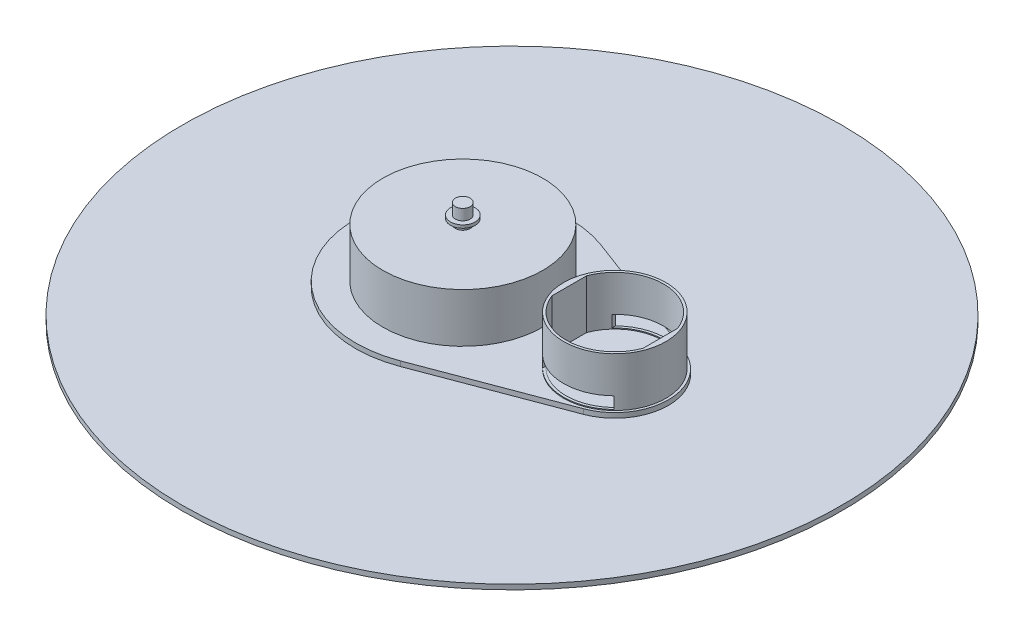
ISO-10303-21;
HEADER;
FILE_DESCRIPTION(('STEP AP214'),'2;1');
FILE_NAME('part.step','',(''),(''),'','','');
FILE_SCHEMA(('AUTOMOTIVE_DESIGN { 1 0 10303 214 1 1 1 1 }'));
ENDSEC;
DATA;
#1=APPLICATION_CONTEXT('core data for automotive mechanical design processes');
#2=APPLICATION_PROTOCOL_DEFINITION('international standard','automotive_design',2000,#1);
#3=PRODUCT_CONTEXT('',#1,'mechanical');
#4=PRODUCT('Part','Part','',(#3));
#5=PRODUCT_RELATED_PRODUCT_CATEGORY('part','',(#4));
#6=PRODUCT_DEFINITION_FORMATION('','',#4);
#7=PRODUCT_DEFINITION_CONTEXT('part definition',#1,'design');
#8=PRODUCT_DEFINITION('design','',#6,#7);
#9=PRODUCT_DEFINITION_SHAPE('','',#8);
#10=(LENGTH_UNIT() NAMED_UNIT(*) SI_UNIT(.MILLI.,.METRE.));
#11=(NAMED_UNIT(*) PLANE_ANGLE_UNIT() SI_UNIT($,.RADIAN.));
#12=(NAMED_UNIT(*) SI_UNIT($,.STERADIAN.) SOLID_ANGLE_UNIT());
#13=UNCERTAINTY_MEASURE_WITH_UNIT(LENGTH_MEASURE(1.E-05),#10,'distance_accuracy_value','');
#14=(GEOMETRIC_REPRESENTATION_CONTEXT(3) GLOBAL_UNCERTAINTY_ASSIGNED_CONTEXT((#13)) GLOBAL_UNIT_ASSIGNED_CONTEXT((#10,
#11,#12)) REPRESENTATION_CONTEXT('',''));
#15=CARTESIAN_POINT('',(0.,0.,0.));
#16=DIRECTION('',(0.,0.,1.));
#17=DIRECTION('',(1.,0.,0.));
#18=AXIS2_PLACEMENT_3D('',#15,#16,#17);
#19=CARTESIAN_POINT('',(109.,60.3,0.));
#20=DIRECTION('',(0.,-1.,0.));
#21=DIRECTION('',(0.,0.,-1.));
#22=AXIS2_PLACEMENT_3D('',#19,#20,#21);
#23=CYLINDRICAL_SURFACE('',#22,7.5);
#24=CARTESIAN_POINT('',(109.,55.,0.));
#25=DIRECTION('',(0.,1.,0.));
#26=DIRECTION('',(0.,0.,1.));
#27=AXIS2_PLACEMENT_3D('',#24,#25,#26);
#28=CIRCLE('',#27,7.5);
#29=CARTESIAN_POINT('',(109.,55.,7.5));
#30=VERTEX_POINT('',#29);
#31=EDGE_CURVE('E198',#30,#30,#28,.T.);
#32=ORIENTED_EDGE('',*,*,#31,.T.);
#33=EDGE_LOOP('',(#32));
#34=FACE_BOUND('',#33,.T.);
#35=CARTESIAN_POINT('',(109.,60.3,0.));
#36=DIRECTION('',(0.,1.,0.));
#37=DIRECTION('',(0.,0.,1.));
#38=AXIS2_PLACEMENT_3D('',#35,#36,#37);
#39=CIRCLE('',#38,7.5);
#40=CARTESIAN_POINT('',(109.,60.3,7.5));
#41=VERTEX_POINT('',#40);
#42=EDGE_CURVE('E213',#41,#41,#39,.T.);
#43=ORIENTED_EDGE('',*,*,#42,.F.);
#44=EDGE_LOOP('',(#43));
#45=FACE_BOUND('',#44,.T.);
#46=ADVANCED_FACE('F40',(#34,#45),#23,.T.);
#47=CARTESIAN_POINT('',(109.,63.3,0.));
#48=DIRECTION('',(0.,-1.,0.));
#49=DIRECTION('',(0.,0.,-1.));
#50=AXIS2_PLACEMENT_3D('',#47,#48,#49);
#51=CYLINDRICAL_SURFACE('',#50,12.5);
#52=CARTESIAN_POINT('',(109.,63.3,0.));
#53=DIRECTION('',(0.,1.,0.));
#54=DIRECTION('',(0.,0.,1.));
#55=AXIS2_PLACEMENT_3D('',#52,#53,#54);
#56=CIRCLE('',#55,12.5);
#57=CARTESIAN_POINT('',(109.,63.3,12.5));
#58=VERTEX_POINT('',#57);
#59=EDGE_CURVE('E210',#58,#58,#56,.T.);
#60=ORIENTED_EDGE('',*,*,#59,.F.);
#61=EDGE_LOOP('',(#60));
#62=FACE_BOUND('',#61,.T.);
#63=CARTESIAN_POINT('',(109.,60.3,0.));
#64=DIRECTION('',(0.,1.,0.));
#65=DIRECTION('',(0.,0.,1.));
#66=AXIS2_PLACEMENT_3D('',#63,#64,#65);
#67=CIRCLE('',#66,12.5);
#68=CARTESIAN_POINT('',(109.,60.3,12.5));
#69=VERTEX_POINT('',#68);
#70=EDGE_CURVE('E204',#69,#69,#67,.T.);
#71=ORIENTED_EDGE('',*,*,#70,.T.);
#72=EDGE_LOOP('',(#71));
#73=FACE_BOUND('',#72,.T.);
#74=ADVANCED_FACE('F338',(#62,#73),#51,.T.);
#75=CARTESIAN_POINT('',(0.,63.3,0.));
#76=DIRECTION('',(0.,1.,0.));
#77=DIRECTION('',(0.,0.,1.));
#78=AXIS2_PLACEMENT_3D('',#75,#76,#77);
#79=PLANE('',#78);
#80=CARTESIAN_POINT('',(109.,63.3,0.));
#81=DIRECTION('',(0.,1.,0.));
#82=DIRECTION('',(0.,0.,1.));
#83=AXIS2_PLACEMENT_3D('',#80,#81,#82);
#84=CIRCLE('',#83,7.5);
#85=CARTESIAN_POINT('',(109.,63.3,7.5));
#86=VERTEX_POINT('',#85);
#87=EDGE_CURVE('E205',#86,#86,#84,.T.);
#88=ORIENTED_EDGE('',*,*,#87,.F.);
#89=EDGE_LOOP('',(#88));
#90=FACE_BOUND('',#89,.T.);
#91=ORIENTED_EDGE('',*,*,#59,.T.);
#92=EDGE_LOOP('',(#91));
#93=FACE_BOUND('',#92,.T.);
#94=ADVANCED_FACE('F346',(#90,#93),#79,.T.);
#95=CARTESIAN_POINT('',(0.,60.3,0.));
#96=DIRECTION('',(0.,1.,0.));
#97=DIRECTION('',(0.,0.,1.));
#98=AXIS2_PLACEMENT_3D('',#95,#96,#97);
#99=PLANE('',#98);
#100=ORIENTED_EDGE('',*,*,#42,.T.);
#101=EDGE_LOOP('',(#100));
#102=FACE_BOUND('',#101,.T.);
#103=ORIENTED_EDGE('',*,*,#70,.F.);
#104=EDGE_LOOP('',(#103));
#105=FACE_BOUND('',#104,.T.);
#106=ADVANCED_FACE('F432',(#102,#105),#99,.F.);
#107=CARTESIAN_POINT('',(109.,74.3,0.));
#108=DIRECTION('',(0.,-1.,0.));
#109=DIRECTION('',(0.,0.,-1.));
#110=AXIS2_PLACEMENT_3D('',#107,#108,#109);
#111=CYLINDRICAL_SURFACE('',#110,7.5);
#112=CARTESIAN_POINT('',(109.,74.3,0.));
#113=DIRECTION('',(0.,1.,0.));
#114=DIRECTION('',(0.,0.,1.));
#115=AXIS2_PLACEMENT_3D('',#112,#113,#114);
#116=CIRCLE('',#115,7.5);
#117=CARTESIAN_POINT('',(109.,74.3,7.5));
#118=VERTEX_POINT('',#117);
#119=EDGE_CURVE('E201',#118,#118,#116,.T.);
#120=ORIENTED_EDGE('',*,*,#119,.F.);
#121=EDGE_LOOP('',(#120));
#122=FACE_BOUND('',#121,.T.);
#123=ORIENTED_EDGE('',*,*,#87,.T.);
#124=EDGE_LOOP('',(#123));
#125=FACE_BOUND('',#124,.T.);
#126=ADVANCED_FACE('F428',(#122,#125),#111,.T.);
#127=CARTESIAN_POINT('',(109.,74.3,0.));
#128=DIRECTION('',(0.,1.,0.));
#129=DIRECTION('',(0.,0.,1.));
#130=AXIS2_PLACEMENT_3D('',#127,#128,#129);
#131=PLANE('',#130);
#132=ORIENTED_EDGE('',*,*,#119,.T.);
#133=EDGE_LOOP('',(#132));
#134=FACE_BOUND('',#133,.T.);
#135=ADVANCED_FACE('F424',(#134),#131,.T.);
#136=CARTESIAN_POINT('',(109.,55.,0.));
#137=DIRECTION('',(0.,-1.,0.));
#138=DIRECTION('',(0.,0.,-1.));
#139=AXIS2_PLACEMENT_3D('',#136,#137,#138);
#140=CYLINDRICAL_SURFACE('',#139,81.2755826030411);
#141=CARTESIAN_POINT('',(109.,55.,0.));
#142=DIRECTION('',(0.,1.,0.));
#143=DIRECTION('',(0.,0.,1.));
#144=AXIS2_PLACEMENT_3D('',#141,#142,#143);
#145=CIRCLE('',#144,81.2755826030411);
#146=CARTESIAN_POINT('',(109.,55.,81.2755826030411));
#147=VERTEX_POINT('',#146);
#148=EDGE_CURVE('E195',#147,#147,#145,.T.);
#149=ORIENTED_EDGE('',*,*,#148,.F.);
#150=EDGE_LOOP('',(#149));
#151=FACE_BOUND('',#150,.T.);
#152=CARTESIAN_POINT('',(109.,5.,0.));
#153=DIRECTION('',(0.,1.,0.));
#154=DIRECTION('',(0.,0.,1.));
#155=AXIS2_PLACEMENT_3D('',#152,#153,#154);
#156=CIRCLE('',#155,81.2755826030411);
#157=CARTESIAN_POINT('',(109.,5.,81.2755826030411));
#158=VERTEX_POINT('',#157);
#159=EDGE_CURVE('E192',#158,#158,#156,.T.);
#160=ORIENTED_EDGE('',*,*,#159,.T.);
#161=EDGE_LOOP('',(#160));
#162=FACE_BOUND('',#161,.T.);
#163=ADVANCED_FACE('F420',(#151,#162),#140,.T.);
#164=CARTESIAN_POINT('',(109.,55.,0.));
#165=DIRECTION('',(0.,1.,0.));
#166=DIRECTION('',(0.,0.,1.));
#167=AXIS2_PLACEMENT_3D('',#164,#165,#166);
#168=PLANE('',#167);
#169=ORIENTED_EDGE('',*,*,#31,.F.);
#170=EDGE_LOOP('',(#169));
#171=FACE_BOUND('',#170,.T.);
#172=ORIENTED_EDGE('',*,*,#148,.T.);
#173=EDGE_LOOP('',(#172));
#174=FACE_BOUND('',#173,.T.);
#175=ADVANCED_FACE('F376',(#171,#174),#168,.T.);
#176=CARTESIAN_POINT('',(0.,5.,0.));
#177=DIRECTION('',(0.,1.,0.));
#178=DIRECTION('',(0.,0.,1.));
#179=AXIS2_PLACEMENT_3D('',#176,#177,#178);
#180=PLANE('',#179);
#181=CARTESIAN_POINT('',(263.5,5.,0.));
#182=DIRECTION('',(0.,1.,0.));
#183=DIRECTION('',(0.,0.,1.));
#184=AXIS2_PLACEMENT_3D('',#181,#182,#183);
#185=CIRCLE('',#184,49.5);
#186=CARTESIAN_POINT('',(309.75,5.,-17.6405073623181));
#187=VERTEX_POINT('',#186);
#188=CARTESIAN_POINT('',(217.25,5.,-17.6405073623181));
#189=VERTEX_POINT('',#188);
#190=EDGE_CURVE('E218',#187,#189,#185,.T.);
#191=ORIENTED_EDGE('',*,*,#190,.T.);
#192=DIRECTION('',(0.,0.,1.));
#193=VECTOR('',#192,1.);
#194=CARTESIAN_POINT('',(217.25,5.,-17.6405073623181));
#195=LINE('',#194,#193);
#196=CARTESIAN_POINT('',(217.25,5.,17.6405073623181));
#197=VERTEX_POINT('',#196);
#198=EDGE_CURVE('E231',#189,#197,#195,.T.);
#199=ORIENTED_EDGE('',*,*,#198,.T.);
#200=CARTESIAN_POINT('',(263.5,5.,0.));
#201=DIRECTION('',(0.,1.,0.));
#202=DIRECTION('',(0.,0.,1.));
#203=AXIS2_PLACEMENT_3D('',#200,#201,#202);
#204=CIRCLE('',#203,49.5);
#205=CARTESIAN_POINT('',(309.75,5.,17.6405073623181));
#206=VERTEX_POINT('',#205);
#207=EDGE_CURVE('E233',#197,#206,#204,.T.);
#208=ORIENTED_EDGE('',*,*,#207,.T.);
#209=DIRECTION('',(0.,0.,-1.));
#210=VECTOR('',#209,1.);
#211=CARTESIAN_POINT('',(309.75,5.,-17.6405073623181));
#212=LINE('',#211,#210);
#213=EDGE_CURVE('E222',#206,#187,#212,.T.);
#214=ORIENTED_EDGE('',*,*,#213,.T.);
#215=EDGE_LOOP('',(#191,#199,#208,#214));
#216=FACE_BOUND('',#215,.T.);
#217=ADVANCED_FACE('F359',(#216),#180,.T.);
#218=CARTESIAN_POINT('',(263.5,55.,0.));
#219=DIRECTION('',(0.,-1.,0.));
#220=DIRECTION('',(0.,0.,-1.));
#221=AXIS2_PLACEMENT_3D('',#218,#219,#220);
#222=CYLINDRICAL_SURFACE('',#221,49.5);
#223=DIRECTION('',(0.,-1.,0.));
#224=VECTOR('',#223,1.);
#225=CARTESIAN_POINT('',(227.090087399466,55.,33.5345831108941));
#226=LINE('',#225,#224);
#227=CARTESIAN_POINT('',(227.090087399466,6.,33.5345831108941));
#228=VERTEX_POINT('',#227);
#229=CARTESIAN_POINT('',(227.090087399466,18.,33.5345831108941));
#230=VERTEX_POINT('',#229);
#231=EDGE_CURVE('E186',#228,#230,#226,.F.);
#232=ORIENTED_EDGE('',*,*,#231,.F.);
#233=CARTESIAN_POINT('',(263.5,6.00000000000001,0.));
#234=DIRECTION('',(0.,-1.,0.));
#235=DIRECTION('',(1.,0.,0.));
#236=AXIS2_PLACEMENT_3D('',#233,#234,#235);
#237=CIRCLE('',#236,49.5);
#238=CARTESIAN_POINT('',(299.909912600534,6.00000000000001,33.5345831108941));
#239=VERTEX_POINT('',#238);
#240=EDGE_CURVE('E159',#239,#228,#237,.T.);
#241=ORIENTED_EDGE('',*,*,#240,.F.);
#242=DIRECTION('',(0.,-1.,0.));
#243=VECTOR('',#242,1.);
#244=CARTESIAN_POINT('',(299.909912600534,55.,33.5345831108941));
#245=LINE('',#244,#243);
#246=CARTESIAN_POINT('',(299.909912600534,18.,33.5345831108941));
#247=VERTEX_POINT('',#246);
#248=EDGE_CURVE('E176',#247,#239,#245,.T.);
#249=ORIENTED_EDGE('',*,*,#248,.F.);
#250=CARTESIAN_POINT('',(263.5,18.,0.));
#251=DIRECTION('',(0.,1.,0.));
#252=DIRECTION('',(-1.,0.,0.));
#253=AXIS2_PLACEMENT_3D('',#250,#251,#252);
#254=CIRCLE('',#253,49.5);
#255=EDGE_CURVE('E182',#230,#247,#254,.T.);
#256=ORIENTED_EDGE('',*,*,#255,.F.);
#257=EDGE_LOOP('',(#232,#241,#249,#256));
#258=FACE_BOUND('',#257,.T.);
#259=ORIENTED_EDGE('',*,*,#207,.F.);
#260=DIRECTION('',(0.,-1.,0.));
#261=VECTOR('',#260,1.);
#262=CARTESIAN_POINT('',(217.25,55.,17.6405073623181));
#263=LINE('',#262,#261);
#264=CARTESIAN_POINT('',(217.25,55.,17.6405073623181));
#265=VERTEX_POINT('',#264);
#266=EDGE_CURVE('E241',#265,#197,#263,.T.);
#267=ORIENTED_EDGE('',*,*,#266,.F.);
#268=CARTESIAN_POINT('',(263.5,55.,0.));
#269=DIRECTION('',(0.,1.,0.));
#270=DIRECTION('',(0.,0.,1.));
#271=AXIS2_PLACEMENT_3D('',#268,#269,#270);
#272=CIRCLE('',#271,49.5);
#273=CARTESIAN_POINT('',(309.75,55.,17.6405073623181));
#274=VERTEX_POINT('',#273);
#275=EDGE_CURVE('E224',#265,#274,#272,.T.);
#276=ORIENTED_EDGE('',*,*,#275,.T.);
#277=DIRECTION('',(0.,-1.,0.));
#278=VECTOR('',#277,1.);
#279=CARTESIAN_POINT('',(309.75,55.,17.6405073623181));
#280=LINE('',#279,#278);
#281=EDGE_CURVE('E238',#274,#206,#280,.T.);
#282=ORIENTED_EDGE('',*,*,#281,.T.);
#283=EDGE_LOOP('',(#259,#267,#276,#282));
#284=FACE_BOUND('',#283,.T.);
#285=ADVANCED_FACE('F355',(#258,#284),#222,.F.);
#286=CARTESIAN_POINT('',(309.75,55.,-17.6405073623181));
#287=DIRECTION('',(-1.,0.,0.));
#288=DIRECTION('',(0.,0.,1.));
#289=AXIS2_PLACEMENT_3D('',#286,#287,#288);
#290=PLANE('',#289);
#291=ORIENTED_EDGE('',*,*,#213,.F.);
#292=ORIENTED_EDGE('',*,*,#281,.F.);
#293=DIRECTION('',(0.,0.,-1.));
#294=VECTOR('',#293,1.);
#295=CARTESIAN_POINT('',(309.75,55.,-17.6405073623181));
#296=LINE('',#295,#294);
#297=CARTESIAN_POINT('',(309.75,55.,-17.6405073623181));
#298=VERTEX_POINT('',#297);
#299=EDGE_CURVE('E227',#274,#298,#296,.T.);
#300=ORIENTED_EDGE('',*,*,#299,.T.);
#301=DIRECTION('',(0.,-1.,0.));
#302=VECTOR('',#301,1.);
#303=CARTESIAN_POINT('',(309.75,55.,-17.6405073623181));
#304=LINE('',#303,#302);
#305=EDGE_CURVE('E229',#298,#187,#304,.T.);
#306=ORIENTED_EDGE('',*,*,#305,.T.);
#307=EDGE_LOOP('',(#291,#292,#300,#306));
#308=FACE_BOUND('',#307,.T.);
#309=ADVANCED_FACE('F352',(#308),#290,.T.);
#310=CARTESIAN_POINT('',(263.5,55.,0.));
#311=DIRECTION('',(0.,-1.,0.));
#312=DIRECTION('',(0.,0.,-1.));
#313=AXIS2_PLACEMENT_3D('',#310,#311,#312);
#314=CYLINDRICAL_SURFACE('',#313,49.5);
#315=DIRECTION('',(0.,-1.,0.));
#316=VECTOR('',#315,1.);
#317=CARTESIAN_POINT('',(227.090087399466,55.,-33.5345831108941));
#318=LINE('',#317,#316);
#319=CARTESIAN_POINT('',(227.090087399466,18.,-33.5345831108941));
#320=VERTEX_POINT('',#319);
#321=CARTESIAN_POINT('',(227.090087399466,6.,-33.5345831108941));
#322=VERTEX_POINT('',#321);
#323=EDGE_CURVE('E184',#320,#322,#318,.T.);
#324=ORIENTED_EDGE('',*,*,#323,.F.);
#325=CARTESIAN_POINT('',(263.5,18.,0.));
#326=DIRECTION('',(0.,1.,0.));
#327=DIRECTION('',(-1.,0.,0.));
#328=AXIS2_PLACEMENT_3D('',#325,#326,#327);
#329=CIRCLE('',#328,49.5);
#330=CARTESIAN_POINT('',(299.909912600534,18.,-33.5345831108941));
#331=VERTEX_POINT('',#330);
#332=EDGE_CURVE('E175',#331,#320,#329,.T.);
#333=ORIENTED_EDGE('',*,*,#332,.F.);
#334=DIRECTION('',(0.,-1.,0.));
#335=VECTOR('',#334,1.);
#336=CARTESIAN_POINT('',(299.909912600534,55.,-33.5345831108941));
#337=LINE('',#336,#335);
#338=CARTESIAN_POINT('',(299.909912600534,6.00000000000001,-33.5345831108941));
#339=VERTEX_POINT('',#338);
#340=EDGE_CURVE('E165',#339,#331,#337,.F.);
#341=ORIENTED_EDGE('',*,*,#340,.F.);
#342=CARTESIAN_POINT('',(263.5,6.00000000000001,0.));
#343=DIRECTION('',(0.,-1.,0.));
#344=DIRECTION('',(1.,0.,0.));
#345=AXIS2_PLACEMENT_3D('',#342,#343,#344);
#346=CIRCLE('',#345,49.5);
#347=EDGE_CURVE('E151',#322,#339,#346,.T.);
#348=ORIENTED_EDGE('',*,*,#347,.F.);
#349=EDGE_LOOP('',(#324,#333,#341,#348));
#350=FACE_BOUND('',#349,.T.);
#351=ORIENTED_EDGE('',*,*,#190,.F.);
#352=ORIENTED_EDGE('',*,*,#305,.F.);
#353=CARTESIAN_POINT('',(263.5,55.,0.));
#354=DIRECTION('',(0.,1.,0.));
#355=DIRECTION('',(0.,0.,1.));
#356=AXIS2_PLACEMENT_3D('',#353,#354,#355);
#357=CIRCLE('',#356,49.5);
#358=CARTESIAN_POINT('',(217.25,55.,-17.6405073623181));
#359=VERTEX_POINT('',#358);
#360=EDGE_CURVE('E219',#298,#359,#357,.T.);
#361=ORIENTED_EDGE('',*,*,#360,.T.);
#362=DIRECTION('',(0.,-1.,0.));
#363=VECTOR('',#362,1.);
#364=CARTESIAN_POINT('',(217.25,55.,-17.6405073623181));
#365=LINE('',#364,#363);
#366=EDGE_CURVE('E244',#359,#189,#365,.T.);
#367=ORIENTED_EDGE('',*,*,#366,.T.);
#368=EDGE_LOOP('',(#351,#352,#361,#367));
#369=FACE_BOUND('',#368,.T.);
#370=ADVANCED_FACE('F173',(#350,#369),#314,.F.);
#371=CARTESIAN_POINT('',(217.25,55.,-17.6405073623181));
#372=DIRECTION('',(1.,0.,0.));
#373=DIRECTION('',(0.,0.,-1.));
#374=AXIS2_PLACEMENT_3D('',#371,#372,#373);
#375=PLANE('',#374);
#376=ORIENTED_EDGE('',*,*,#198,.F.);
#377=ORIENTED_EDGE('',*,*,#366,.F.);
#378=DIRECTION('',(0.,0.,1.));
#379=VECTOR('',#378,1.);
#380=CARTESIAN_POINT('',(217.25,55.,-17.6405073623181));
#381=LINE('',#380,#379);
#382=EDGE_CURVE('E221',#359,#265,#381,.T.);
#383=ORIENTED_EDGE('',*,*,#382,.T.);
#384=ORIENTED_EDGE('',*,*,#266,.T.);
#385=EDGE_LOOP('',(#376,#377,#383,#384));
#386=FACE_BOUND('',#385,.T.);
#387=ADVANCED_FACE('F361',(#386),#375,.T.);
#388=CARTESIAN_POINT('',(263.5,55.,0.));
#389=DIRECTION('',(0.,1.,0.));
#390=DIRECTION('',(0.,0.,1.));
#391=AXIS2_PLACEMENT_3D('',#388,#389,#390);
#392=PLANE('',#391);
#393=CARTESIAN_POINT('',(263.5,55.,0.));
#394=DIRECTION('',(0.,1.,0.));
#395=DIRECTION('',(0.,0.,1.));
#396=AXIS2_PLACEMENT_3D('',#393,#394,#395);
#397=CIRCLE('',#396,52.);
#398=CARTESIAN_POINT('',(263.5,55.,52.));
#399=VERTEX_POINT('',#398);
#400=EDGE_CURVE('E248',#399,#399,#397,.T.);
#401=ORIENTED_EDGE('',*,*,#400,.T.);
#402=EDGE_LOOP('',(#401));
#403=FACE_BOUND('',#402,.T.);
#404=ORIENTED_EDGE('',*,*,#382,.F.);
#405=ORIENTED_EDGE('',*,*,#360,.F.);
#406=ORIENTED_EDGE('',*,*,#299,.F.);
#407=ORIENTED_EDGE('',*,*,#275,.F.);
#408=EDGE_LOOP('',(#404,#405,#406,#407));
#409=FACE_BOUND('',#408,.T.);
#410=ADVANCED_FACE('F364',(#403,#409),#392,.T.);
#411=CARTESIAN_POINT('',(263.5,55.,0.));
#412=DIRECTION('',(0.,-1.,0.));
#413=DIRECTION('',(0.,0.,-1.));
#414=AXIS2_PLACEMENT_3D('',#411,#412,#413);
#415=CYLINDRICAL_SURFACE('',#414,52.);
#416=CARTESIAN_POINT('',(263.5,6.00000000000001,0.));
#417=DIRECTION('',(0.,-1.,0.));
#418=DIRECTION('',(1.,0.,0.));
#419=AXIS2_PLACEMENT_3D('',#416,#417,#418);
#420=CIRCLE('',#419,52.);
#421=CARTESIAN_POINT('',(299.909912600534,6.00000000000001,37.1257089416682));
#422=VERTEX_POINT('',#421);
#423=CARTESIAN_POINT('',(227.090087399466,6.,37.1257089416682));
#424=VERTEX_POINT('',#423);
#425=EDGE_CURVE('E287',#422,#424,#420,.T.);
#426=ORIENTED_EDGE('',*,*,#425,.T.);
#427=DIRECTION('',(0.,-1.,0.));
#428=VECTOR('',#427,1.);
#429=CARTESIAN_POINT('',(227.090087399466,55.,37.1257089416682));
#430=LINE('',#429,#428);
#431=CARTESIAN_POINT('',(227.090087399466,18.,37.1257089416682));
#432=VERTEX_POINT('',#431);
#433=EDGE_CURVE('E11',#424,#432,#430,.F.);
#434=ORIENTED_EDGE('',*,*,#433,.T.);
#435=CARTESIAN_POINT('',(263.5,18.,0.));
#436=DIRECTION('',(0.,1.,0.));
#437=DIRECTION('',(-1.,0.,0.));
#438=AXIS2_PLACEMENT_3D('',#435,#436,#437);
#439=CIRCLE('',#438,52.);
#440=CARTESIAN_POINT('',(299.909912600534,18.,37.1257089416682));
#441=VERTEX_POINT('',#440);
#442=EDGE_CURVE('E48',#432,#441,#439,.T.);
#443=ORIENTED_EDGE('',*,*,#442,.T.);
#444=DIRECTION('',(0.,-1.,0.));
#445=VECTOR('',#444,1.);
#446=CARTESIAN_POINT('',(299.909912600534,55.,37.1257089416682));
#447=LINE('',#446,#445);
#448=EDGE_CURVE('E294',#441,#422,#447,.T.);
#449=ORIENTED_EDGE('',*,*,#448,.T.);
#450=EDGE_LOOP('',(#426,#434,#443,#449));
#451=FACE_BOUND('',#450,.T.);
#452=CARTESIAN_POINT('',(299.909912600534,18.,-37.1257089416682));
#453=VERTEX_POINT('',#452);
#454=CARTESIAN_POINT('',(227.090087399466,18.,-37.1257089416682));
#455=VERTEX_POINT('',#454);
#456=EDGE_CURVE('E289',#453,#455,#439,.T.);
#457=ORIENTED_EDGE('',*,*,#456,.T.);
#458=DIRECTION('',(0.,-1.,0.));
#459=VECTOR('',#458,1.);
#460=CARTESIAN_POINT('',(227.090087399466,55.,-37.1257089416682));
#461=LINE('',#460,#459);
#462=CARTESIAN_POINT('',(227.090087399466,6.,-37.1257089416682));
#463=VERTEX_POINT('',#462);
#464=EDGE_CURVE('E292',#455,#463,#461,.T.);
#465=ORIENTED_EDGE('',*,*,#464,.T.);
#466=CARTESIAN_POINT('',(299.909912600534,6.00000000000001,-37.1257089416682));
#467=VERTEX_POINT('',#466);
#468=EDGE_CURVE('E208',#463,#467,#420,.T.);
#469=ORIENTED_EDGE('',*,*,#468,.T.);
#470=DIRECTION('',(0.,-1.,0.));
#471=VECTOR('',#470,1.);
#472=CARTESIAN_POINT('',(299.909912600534,55.,-37.1257089416682));
#473=LINE('',#472,#471);
#474=EDGE_CURVE('E168',#467,#453,#473,.F.);
#475=ORIENTED_EDGE('',*,*,#474,.T.);
#476=EDGE_LOOP('',(#457,#465,#469,#475));
#477=FACE_BOUND('',#476,.T.);
#478=ORIENTED_EDGE('',*,*,#400,.F.);
#479=EDGE_LOOP('',(#478));
#480=FACE_BOUND('',#479,.T.);
#481=CARTESIAN_POINT('',(263.5,5.,0.));
#482=DIRECTION('',(0.,1.,0.));
#483=DIRECTION('',(0.,0.,1.));
#484=AXIS2_PLACEMENT_3D('',#481,#482,#483);
#485=CIRCLE('',#484,52.);
#486=CARTESIAN_POINT('',(263.5,5.,52.));
#487=VERTEX_POINT('',#486);
#488=EDGE_CURVE('E247',#487,#487,#485,.T.);
#489=ORIENTED_EDGE('',*,*,#488,.T.);
#490=EDGE_LOOP('',(#489));
#491=FACE_BOUND('',#490,.T.);
#492=ADVANCED_FACE('F299',(#451,#477,#480,#491),#415,.T.);
#493=CARTESIAN_POINT('',(263.5,5.,0.));
#494=DIRECTION('',(0.,-1.,0.));
#495=DIRECTION('',(0.,0.,-1.));
#496=AXIS2_PLACEMENT_3D('',#493,#494,#495);
#497=CYLINDRICAL_SURFACE('',#496,54.5);
#498=CARTESIAN_POINT('',(263.5,0.,0.));
#499=DIRECTION('',(0.,1.,0.));
#500=DIRECTION('',(0.,0.,1.));
#501=AXIS2_PLACEMENT_3D('',#498,#499,#500);
#502=CIRCLE('',#501,54.5);
#503=CARTESIAN_POINT('',(282.724919093851,0.,50.996592884573));
#504=VERTEX_POINT('',#503);
#505=CARTESIAN_POINT('',(282.724919093851,0.,-50.9965928845729));
#506=VERTEX_POINT('',#505);
#507=EDGE_CURVE('E258',#504,#506,#502,.T.);
#508=ORIENTED_EDGE('',*,*,#507,.T.);
#509=DIRECTION('',(0.,-1.,0.));
#510=VECTOR('',#509,1.);
#511=CARTESIAN_POINT('',(282.724919093851,5.,-50.9965928845729));
#512=LINE('',#511,#510);
#513=CARTESIAN_POINT('',(282.724919093851,5.,-50.9965928845729));
#514=VERTEX_POINT('',#513);
#515=EDGE_CURVE('E264',#514,#506,#512,.T.);
#516=ORIENTED_EDGE('',*,*,#515,.F.);
#517=CARTESIAN_POINT('',(263.5,5.,0.));
#518=DIRECTION('',(0.,1.,0.));
#519=DIRECTION('',(0.,0.,1.));
#520=AXIS2_PLACEMENT_3D('',#517,#518,#519);
#521=CIRCLE('',#520,54.5);
#522=CARTESIAN_POINT('',(282.724919093851,5.,50.996592884573));
#523=VERTEX_POINT('',#522);
#524=EDGE_CURVE('E262',#523,#514,#521,.T.);
#525=ORIENTED_EDGE('',*,*,#524,.F.);
#526=DIRECTION('',(0.,-1.,0.));
#527=VECTOR('',#526,1.);
#528=CARTESIAN_POINT('',(282.724919093851,5.,50.996592884573));
#529=LINE('',#528,#527);
#530=EDGE_CURVE('E276',#523,#504,#529,.T.);
#531=ORIENTED_EDGE('',*,*,#530,.T.);
#532=EDGE_LOOP('',(#508,#516,#525,#531));
#533=FACE_BOUND('',#532,.T.);
#534=ADVANCED_FACE('F373',(#533),#497,.T.);
#535=CARTESIAN_POINT('',(52.0130497166975,5.,137.971364567971));
#536=DIRECTION('',(-0.352750809061489,0.,-0.935717300634367));
#537=DIRECTION('',(-0.935717300634367,0.,0.352750809061489));
#538=AXIS2_PLACEMENT_3D('',#535,#536,#537);
#539=PLANE('',#538);
#540=DIRECTION('',(0.935717300634366,0.,-0.352750809061489));
#541=VECTOR('',#540,1.);
#542=CARTESIAN_POINT('',(52.0130497166975,0.,137.971364567971));
#543=LINE('',#542,#541);
#544=CARTESIAN_POINT('',(147.449838187702,0.,101.993185769146));
#545=VERTEX_POINT('',#544);
#546=EDGE_CURVE('E269',#545,#504,#543,.T.);
#547=ORIENTED_EDGE('',*,*,#546,.T.);
#548=ORIENTED_EDGE('',*,*,#530,.F.);
#549=DIRECTION('',(0.935717300634366,0.,-0.352750809061489));
#550=VECTOR('',#549,1.);
#551=CARTESIAN_POINT('',(52.0130497166975,5.,137.971364567971));
#552=LINE('',#551,#550);
#553=CARTESIAN_POINT('',(147.449838187702,5.,101.993185769146));
#554=VERTEX_POINT('',#553);
#555=EDGE_CURVE('E260',#554,#523,#552,.T.);
#556=ORIENTED_EDGE('',*,*,#555,.F.);
#557=DIRECTION('',(0.,-1.,0.));
#558=VECTOR('',#557,1.);
#559=CARTESIAN_POINT('',(147.449838187702,5.,101.993185769146));
#560=LINE('',#559,#558);
#561=EDGE_CURVE('E279',#554,#545,#560,.T.);
#562=ORIENTED_EDGE('',*,*,#561,.T.);
#563=EDGE_LOOP('',(#547,#548,#556,#562));
#564=FACE_BOUND('',#563,.T.);
#565=ADVANCED_FACE('F381',(#564),#539,.F.);
#566=CARTESIAN_POINT('',(109.,5.,0.));
#567=DIRECTION('',(0.,-1.,0.));
#568=DIRECTION('',(0.,0.,-1.));
#569=AXIS2_PLACEMENT_3D('',#566,#567,#568);
#570=CYLINDRICAL_SURFACE('',#569,109.);
#571=CARTESIAN_POINT('',(109.,0.,0.));
#572=DIRECTION('',(0.,1.,0.));
#573=DIRECTION('',(0.,0.,1.));
#574=AXIS2_PLACEMENT_3D('',#571,#572,#573);
#575=CIRCLE('',#574,109.);
#576=CARTESIAN_POINT('',(147.449838187702,0.,-101.993185769146));
#577=VERTEX_POINT('',#576);
#578=EDGE_CURVE('E266',#577,#545,#575,.T.);
#579=ORIENTED_EDGE('',*,*,#578,.T.);
#580=ORIENTED_EDGE('',*,*,#561,.F.);
#581=CARTESIAN_POINT('',(109.,5.,0.));
#582=DIRECTION('',(0.,1.,0.));
#583=DIRECTION('',(0.,0.,1.));
#584=AXIS2_PLACEMENT_3D('',#581,#582,#583);
#585=CIRCLE('',#584,109.);
#586=CARTESIAN_POINT('',(147.449838187702,5.,-101.993185769146));
#587=VERTEX_POINT('',#586);
#588=EDGE_CURVE('E257',#587,#554,#585,.T.);
#589=ORIENTED_EDGE('',*,*,#588,.F.);
#590=DIRECTION('',(0.,-1.,0.));
#591=VECTOR('',#590,1.);
#592=CARTESIAN_POINT('',(147.449838187702,5.,-101.993185769146));
#593=LINE('',#592,#591);
#594=EDGE_CURVE('E209',#587,#577,#593,.T.);
#595=ORIENTED_EDGE('',*,*,#594,.T.);
#596=EDGE_LOOP('',(#579,#580,#589,#595));
#597=FACE_BOUND('',#596,.T.);
#598=ADVANCED_FACE('F384',(#597),#570,.T.);
#599=CARTESIAN_POINT('',(52.0130497166975,5.,-137.971364567971));
#600=DIRECTION('',(0.352750809061489,0.,-0.935717300634367));
#601=DIRECTION('',(-0.935717300634367,0.,-0.352750809061489));
#602=AXIS2_PLACEMENT_3D('',#599,#600,#601);
#603=PLANE('',#602);
#604=DIRECTION('',(0.935717300634366,0.,0.352750809061489));
#605=VECTOR('',#604,1.);
#606=CARTESIAN_POINT('',(52.0130497166975,0.,-137.971364567971));
#607=LINE('',#606,#605);
#608=EDGE_CURVE('E251',#577,#506,#607,.T.);
#609=ORIENTED_EDGE('',*,*,#608,.F.);
#610=ORIENTED_EDGE('',*,*,#594,.F.);
#611=DIRECTION('',(0.935717300634366,0.,0.352750809061489));
#612=VECTOR('',#611,1.);
#613=CARTESIAN_POINT('',(52.0130497166975,5.,-137.971364567971));
#614=LINE('',#613,#612);
#615=EDGE_CURVE('E254',#587,#514,#614,.T.);
#616=ORIENTED_EDGE('',*,*,#615,.T.);
#617=ORIENTED_EDGE('',*,*,#515,.T.);
#618=EDGE_LOOP('',(#609,#610,#616,#617));
#619=FACE_BOUND('',#618,.T.);
#620=ADVANCED_FACE('F42',(#619),#603,.T.);
#621=ORIENTED_EDGE('',*,*,#159,.F.);
#622=EDGE_LOOP('',(#621));
#623=FACE_BOUND('',#622,.T.);
#624=ORIENTED_EDGE('',*,*,#615,.F.);
#625=ORIENTED_EDGE('',*,*,#588,.T.);
#626=ORIENTED_EDGE('',*,*,#555,.T.);
#627=ORIENTED_EDGE('',*,*,#524,.T.);
#628=EDGE_LOOP('',(#624,#625,#626,#627));
#629=FACE_BOUND('',#628,.T.);
#630=ORIENTED_EDGE('',*,*,#488,.F.);
#631=EDGE_LOOP('',(#630));
#632=FACE_BOUND('',#631,.T.);
#633=ADVANCED_FACE('F378',(#623,#629,#632),#180,.T.);
#634=CARTESIAN_POINT('',(0.,0.,0.));
#635=DIRECTION('',(0.,-1.,0.));
#636=DIRECTION('',(0.,0.,-1.));
#637=AXIS2_PLACEMENT_3D('',#634,#635,#636);
#638=PLANE('',#637);
#639=CARTESIAN_POINT('',(159.,0.,0.));
#640=DIRECTION('',(0.,-1.,0.));
#641=DIRECTION('',(0.,0.,-1.));
#642=AXIS2_PLACEMENT_3D('',#639,#640,#641);
#643=CIRCLE('',#642,335.);
#644=CARTESIAN_POINT('',(159.,0.,-335.));
#645=VERTEX_POINT('',#644);
#646=EDGE_CURVE('E188',#645,#645,#643,.T.);
#647=ORIENTED_EDGE('',*,*,#646,.F.);
#648=EDGE_LOOP('',(#647));
#649=FACE_BOUND('',#648,.T.);
#650=ORIENTED_EDGE('',*,*,#578,.F.);
#651=ORIENTED_EDGE('',*,*,#608,.T.);
#652=ORIENTED_EDGE('',*,*,#507,.F.);
#653=ORIENTED_EDGE('',*,*,#546,.F.);
#654=EDGE_LOOP('',(#650,#651,#652,#653));
#655=FACE_BOUND('',#654,.T.);
#656=ADVANCED_FACE('F403',(#649,#655),#638,.F.);
#657=CARTESIAN_POINT('',(159.,-5.,0.));
#658=DIRECTION('',(0.,1.,0.));
#659=DIRECTION('',(0.,0.,1.));
#660=AXIS2_PLACEMENT_3D('',#657,#658,#659);
#661=CYLINDRICAL_SURFACE('',#660,335.);
#662=CARTESIAN_POINT('',(159.,-5.,0.));
#663=DIRECTION('',(0.,-1.,0.));
#664=DIRECTION('',(0.,0.,-1.));
#665=AXIS2_PLACEMENT_3D('',#662,#663,#664);
#666=CIRCLE('',#665,335.);
#667=CARTESIAN_POINT('',(159.,-5.,-335.));
#668=VERTEX_POINT('',#667);
#669=EDGE_CURVE('E189',#668,#668,#666,.T.);
#670=ORIENTED_EDGE('',*,*,#669,.F.);
#671=EDGE_LOOP('',(#670));
#672=FACE_BOUND('',#671,.T.);
#673=ORIENTED_EDGE('',*,*,#646,.T.);
#674=EDGE_LOOP('',(#673));
#675=FACE_BOUND('',#674,.T.);
#676=ADVANCED_FACE('F405',(#672,#675),#661,.T.);
#677=CARTESIAN_POINT('',(0.,-5.,0.));
#678=DIRECTION('',(0.,-1.,0.));
#679=DIRECTION('',(0.,0.,-1.));
#680=AXIS2_PLACEMENT_3D('',#677,#678,#679);
#681=PLANE('',#680);
#682=ORIENTED_EDGE('',*,*,#669,.T.);
#683=EDGE_LOOP('',(#682));
#684=FACE_BOUND('',#683,.T.);
#685=ADVANCED_FACE('F412',(#684),#681,.T.);
#686=CARTESIAN_POINT('',(227.090087399466,6.,-335.));
#687=DIRECTION('',(0.,-1.,0.));
#688=DIRECTION('',(1.,0.,0.));
#689=AXIS2_PLACEMENT_3D('',#686,#687,#688);
#690=PLANE('',#689);
#691=ORIENTED_EDGE('',*,*,#347,.T.);
#692=DIRECTION('',(0.,0.,1.));
#693=VECTOR('',#692,1.);
#694=CARTESIAN_POINT('',(299.909912600534,6.00000000000001,-335.));
#695=LINE('',#694,#693);
#696=EDGE_CURVE('E154',#467,#339,#695,.T.);
#697=ORIENTED_EDGE('',*,*,#696,.F.);
#698=ORIENTED_EDGE('',*,*,#468,.F.);
#699=DIRECTION('',(0.,0.,1.));
#700=VECTOR('',#699,1.);
#701=CARTESIAN_POINT('',(227.090087399466,6.,-335.));
#702=LINE('',#701,#700);
#703=EDGE_CURVE('E63',#463,#322,#702,.T.);
#704=ORIENTED_EDGE('',*,*,#703,.T.);
#705=EDGE_LOOP('',(#691,#697,#698,#704));
#706=FACE_BOUND('',#705,.T.);
#707=ADVANCED_FACE('F153',(#706),#690,.F.);
#708=CARTESIAN_POINT('',(299.909912600534,6.00000000000001,-335.));
#709=DIRECTION('',(1.,0.,0.));
#710=DIRECTION('',(0.,0.,-1.));
#711=AXIS2_PLACEMENT_3D('',#708,#709,#710);
#712=PLANE('',#711);
#713=ORIENTED_EDGE('',*,*,#340,.T.);
#714=DIRECTION('',(0.,0.,1.));
#715=VECTOR('',#714,1.);
#716=CARTESIAN_POINT('',(299.909912600534,18.,-335.));
#717=LINE('',#716,#715);
#718=EDGE_CURVE('E314',#453,#331,#717,.T.);
#719=ORIENTED_EDGE('',*,*,#718,.F.);
#720=ORIENTED_EDGE('',*,*,#474,.F.);
#721=ORIENTED_EDGE('',*,*,#696,.T.);
#722=EDGE_LOOP('',(#713,#719,#720,#721));
#723=FACE_BOUND('',#722,.T.);
#724=ADVANCED_FACE('F163',(#723),#712,.F.);
#725=CARTESIAN_POINT('',(299.909912600534,18.,-335.));
#726=DIRECTION('',(0.,1.,0.));
#727=DIRECTION('',(-1.,0.,0.));
#728=AXIS2_PLACEMENT_3D('',#725,#726,#727);
#729=PLANE('',#728);
#730=ORIENTED_EDGE('',*,*,#332,.T.);
#731=DIRECTION('',(0.,0.,1.));
#732=VECTOR('',#731,1.);
#733=CARTESIAN_POINT('',(227.090087399466,18.,-335.));
#734=LINE('',#733,#732);
#735=EDGE_CURVE('E160',#455,#320,#734,.T.);
#736=ORIENTED_EDGE('',*,*,#735,.F.);
#737=ORIENTED_EDGE('',*,*,#456,.F.);
#738=ORIENTED_EDGE('',*,*,#718,.T.);
#739=EDGE_LOOP('',(#730,#736,#737,#738));
#740=FACE_BOUND('',#739,.T.);
#741=ADVANCED_FACE('F321',(#740),#729,.F.);
#742=CARTESIAN_POINT('',(227.090087399466,18.,-335.));
#743=DIRECTION('',(-1.,0.,0.));
#744=DIRECTION('',(0.,0.,1.));
#745=AXIS2_PLACEMENT_3D('',#742,#743,#744);
#746=PLANE('',#745);
#747=ORIENTED_EDGE('',*,*,#323,.T.);
#748=ORIENTED_EDGE('',*,*,#703,.F.);
#749=ORIENTED_EDGE('',*,*,#464,.F.);
#750=ORIENTED_EDGE('',*,*,#735,.T.);
#751=EDGE_LOOP('',(#747,#748,#749,#750));
#752=FACE_BOUND('',#751,.T.);
#753=ADVANCED_FACE('F325',(#752),#746,.F.);
#754=ORIENTED_EDGE('',*,*,#231,.T.);
#755=EDGE_CURVE('E315',#230,#432,#734,.T.);
#756=ORIENTED_EDGE('',*,*,#755,.T.);
#757=ORIENTED_EDGE('',*,*,#433,.F.);
#758=EDGE_CURVE('E304',#228,#424,#702,.T.);
#759=ORIENTED_EDGE('',*,*,#758,.F.);
#760=EDGE_LOOP('',(#754,#756,#757,#759));
#761=FACE_BOUND('',#760,.T.);
#762=ADVANCED_FACE('F327',(#761),#746,.F.);
#763=ORIENTED_EDGE('',*,*,#255,.T.);
#764=EDGE_CURVE('E170',#247,#441,#717,.T.);
#765=ORIENTED_EDGE('',*,*,#764,.T.);
#766=ORIENTED_EDGE('',*,*,#442,.F.);
#767=ORIENTED_EDGE('',*,*,#755,.F.);
#768=EDGE_LOOP('',(#763,#765,#766,#767));
#769=FACE_BOUND('',#768,.T.);
#770=ADVANCED_FACE('F333',(#769),#729,.F.);
#771=ORIENTED_EDGE('',*,*,#248,.T.);
#772=EDGE_CURVE('E55',#239,#422,#695,.T.);
#773=ORIENTED_EDGE('',*,*,#772,.T.);
#774=ORIENTED_EDGE('',*,*,#448,.F.);
#775=ORIENTED_EDGE('',*,*,#764,.F.);
#776=EDGE_LOOP('',(#771,#773,#774,#775));
#777=FACE_BOUND('',#776,.T.);
#778=ADVANCED_FACE('F306',(#777),#712,.F.);
#779=ORIENTED_EDGE('',*,*,#240,.T.);
#780=ORIENTED_EDGE('',*,*,#758,.T.);
#781=ORIENTED_EDGE('',*,*,#425,.F.);
#782=ORIENTED_EDGE('',*,*,#772,.F.);
#783=EDGE_LOOP('',(#779,#780,#781,#782));
#784=FACE_BOUND('',#783,.T.);
#785=ADVANCED_FACE('F302',(#784),#690,.F.);
#786=CLOSED_SHELL('',(#46,#74,#94,#106,#126,#135,#163,#175,#217,#285,#309,#370,#387,#410,#492,
#534,#565,#598,#620,#633,#656,#676,#685,#707,#724,#741,#753,#762,#770,#778,#785));
#787=MANIFOLD_SOLID_BREP('B2',#786);
#788=ADVANCED_BREP_SHAPE_REPRESENTATION('',(#18,#787),#14);
#789=SHAPE_DEFINITION_REPRESENTATION(#9,#788);
ENDSEC;
END-ISO-10303-21;
